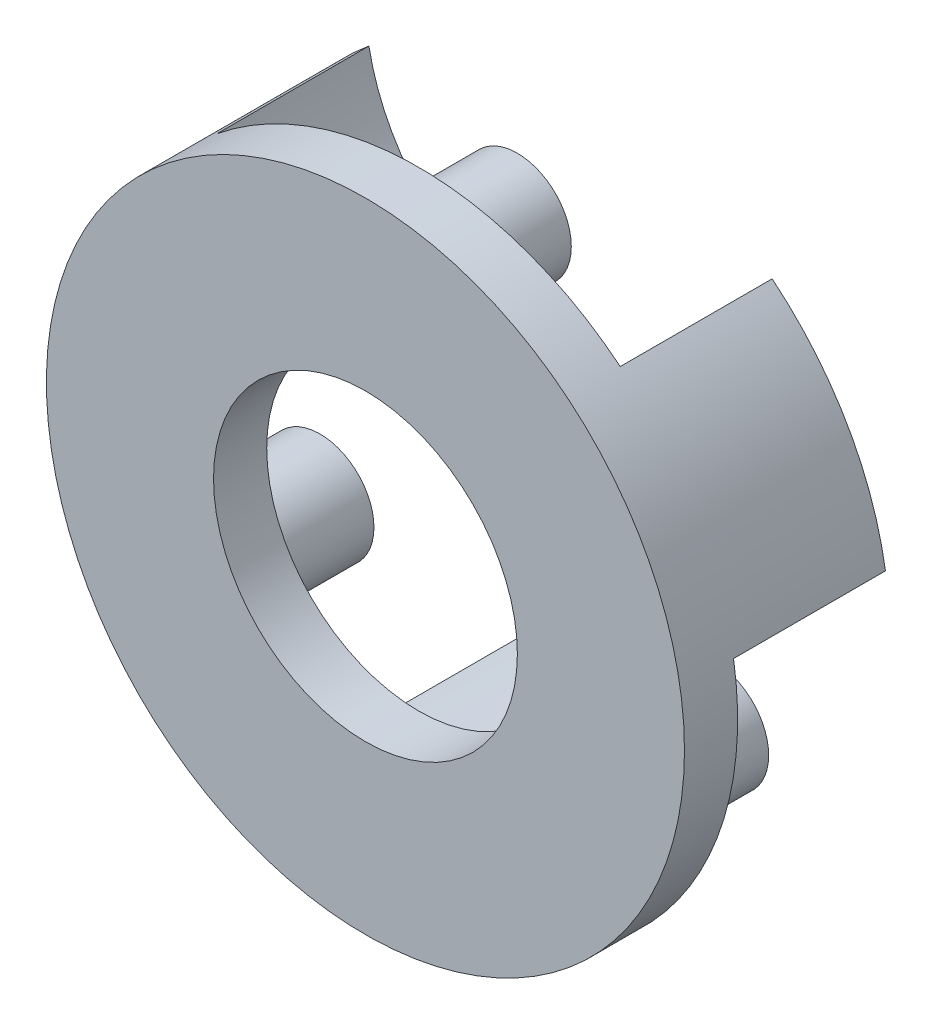
ISO-10303-21;
HEADER;
FILE_DESCRIPTION(('STEP AP214'),'2;1');
FILE_NAME('part.step','',(''),(''),'','','');
FILE_SCHEMA(('AUTOMOTIVE_DESIGN { 1 0 10303 214 1 1 1 1 }'));
ENDSEC;
DATA;
#1=APPLICATION_CONTEXT('core data for automotive mechanical design processes');
#2=APPLICATION_PROTOCOL_DEFINITION('international standard','automotive_design',2000,#1);
#3=PRODUCT_CONTEXT('',#1,'mechanical');
#4=PRODUCT('Part','Part','',(#3));
#5=PRODUCT_RELATED_PRODUCT_CATEGORY('part','',(#4));
#6=PRODUCT_DEFINITION_FORMATION('','',#4);
#7=PRODUCT_DEFINITION_CONTEXT('part definition',#1,'design');
#8=PRODUCT_DEFINITION('design','',#6,#7);
#9=PRODUCT_DEFINITION_SHAPE('','',#8);
#10=(LENGTH_UNIT() NAMED_UNIT(*) SI_UNIT(.MILLI.,.METRE.));
#11=(NAMED_UNIT(*) PLANE_ANGLE_UNIT() SI_UNIT($,.RADIAN.));
#12=(NAMED_UNIT(*) SI_UNIT($,.STERADIAN.) SOLID_ANGLE_UNIT());
#13=UNCERTAINTY_MEASURE_WITH_UNIT(LENGTH_MEASURE(1.E-05),#10,'distance_accuracy_value','');
#14=(GEOMETRIC_REPRESENTATION_CONTEXT(3) GLOBAL_UNCERTAINTY_ASSIGNED_CONTEXT((#13)) GLOBAL_UNIT_ASSIGNED_CONTEXT((#10,
#11,#12)) REPRESENTATION_CONTEXT('',''));
#15=CARTESIAN_POINT('',(0.,0.,0.));
#16=DIRECTION('',(0.,0.,1.));
#17=DIRECTION('',(1.,0.,0.));
#18=AXIS2_PLACEMENT_3D('',#15,#16,#17);
#19=CARTESIAN_POINT('',(0.,0.,0.));
#20=DIRECTION('',(0.,0.,1.));
#21=DIRECTION('',(1.,0.,0.));
#22=AXIS2_PLACEMENT_3D('',#19,#20,#21);
#23=PLANE('',#22);
#24=CARTESIAN_POINT('',(-12.9903810567656,-7.50000000000055,0.));
#25=DIRECTION('',(0.,0.,1.));
#26=DIRECTION('',(1.,0.,0.));
#27=AXIS2_PLACEMENT_3D('',#24,#25,#26);
#28=CIRCLE('',#27,3.55);
#29=CARTESIAN_POINT('',(-9.44038105676563,-7.50000000000055,0.));
#30=VERTEX_POINT('',#29);
#31=EDGE_CURVE('E611',#30,#30,#28,.T.);
#32=ORIENTED_EDGE('',*,*,#31,.T.);
#33=EDGE_LOOP('',(#32));
#34=FACE_BOUND('',#33,.T.);
#35=CARTESIAN_POINT('',(12.9903810567675,-7.49999999999945,0.));
#36=DIRECTION('',(0.,0.,1.));
#37=DIRECTION('',(1.,0.,0.));
#38=AXIS2_PLACEMENT_3D('',#35,#36,#37);
#39=CIRCLE('',#38,3.55);
#40=CARTESIAN_POINT('',(16.5403810567675,-7.49999999999945,0.));
#41=VERTEX_POINT('',#40);
#42=EDGE_CURVE('E618',#41,#41,#39,.T.);
#43=ORIENTED_EDGE('',*,*,#42,.T.);
#44=EDGE_LOOP('',(#43));
#45=FACE_BOUND('',#44,.T.);
#46=CARTESIAN_POINT('',(0.,15.,0.));
#47=DIRECTION('',(0.,0.,1.));
#48=DIRECTION('',(1.,0.,0.));
#49=AXIS2_PLACEMENT_3D('',#46,#47,#48);
#50=CIRCLE('',#49,3.55);
#51=CARTESIAN_POINT('',(3.55,15.,0.));
#52=VERTEX_POINT('',#51);
#53=EDGE_CURVE('E624',#52,#52,#50,.T.);
#54=ORIENTED_EDGE('',*,*,#53,.T.);
#55=EDGE_LOOP('',(#54));
#56=FACE_BOUND('',#55,.T.);
#57=CARTESIAN_POINT('',(0.,0.,0.));
#58=DIRECTION('',(0.,0.,-1.));
#59=DIRECTION('',(-1.,0.,0.));
#60=AXIS2_PLACEMENT_3D('',#57,#58,#59);
#61=CIRCLE('',#60,10.);
#62=CARTESIAN_POINT('',(-10.,0.,0.));
#63=VERTEX_POINT('',#62);
#64=EDGE_CURVE('E223',#63,#63,#61,.T.);
#65=ORIENTED_EDGE('',*,*,#64,.F.);
#66=EDGE_LOOP('',(#65));
#67=FACE_BOUND('',#66,.T.);
#68=CARTESIAN_POINT('',(0.,0.,0.));
#69=DIRECTION('',(0.,0.,-1.));
#70=DIRECTION('',(-1.,0.,0.));
#71=AXIS2_PLACEMENT_3D('',#68,#69,#70);
#72=CIRCLE('',#71,12.5);
#73=CARTESIAN_POINT('',(3.02191559121072,-12.1292219931699,0.));
#74=VERTEX_POINT('',#73);
#75=CARTESIAN_POINT('',(-3.02191559121221,-12.1292219931696,0.));
#76=VERTEX_POINT('',#75);
#77=EDGE_CURVE('E160',#74,#76,#72,.T.);
#78=ORIENTED_EDGE('',*,*,#77,.T.);
#79=CARTESIAN_POINT('',(-16.2379763209581,-9.37499999999878,0.));
#80=DIRECTION('',(0.,0.,-1.));
#81=DIRECTION('',(-1.,0.,0.));
#82=AXIS2_PLACEMENT_3D('',#79,#80,#81);
#83=CIRCLE('',#82,13.4999999999999);
#84=CARTESIAN_POINT('',(-7.45897050021628,-19.6306841214692,0.));
#85=VERTEX_POINT('',#84);
#86=EDGE_CURVE('E133',#76,#85,#83,.T.);
#87=ORIENTED_EDGE('',*,*,#86,.T.);
#88=CARTESIAN_POINT('',(0.,0.,0.));
#89=DIRECTION('',(0.,0.,1.));
#90=DIRECTION('',(1.,0.,0.));
#91=AXIS2_PLACEMENT_3D('',#88,#89,#90);
#92=CIRCLE('',#91,21.);
#93=CARTESIAN_POINT('',(-20.7301563929679,3.35568412147083,0.));
#94=VERTEX_POINT('',#93);
#95=EDGE_CURVE('E231',#94,#85,#92,.T.);
#96=ORIENTED_EDGE('',*,*,#95,.F.);
#97=CARTESIAN_POINT('',(-16.2379763209581,-9.37499999999878,0.));
#98=DIRECTION('',(0.,0.,-1.));
#99=DIRECTION('',(-1.,0.,0.));
#100=AXIS2_PLACEMENT_3D('',#97,#98,#99);
#101=CIRCLE('',#100,13.5);
#102=CARTESIAN_POINT('',(-12.0151721698315,3.44755532650412,0.));
#103=VERTEX_POINT('',#102);
#104=EDGE_CURVE('E62',#94,#103,#101,.T.);
#105=ORIENTED_EDGE('',*,*,#104,.T.);
#106=CARTESIAN_POINT('',(0.,0.,0.));
#107=DIRECTION('',(0.,0.,-1.));
#108=DIRECTION('',(-1.,0.,0.));
#109=AXIS2_PLACEMENT_3D('',#106,#107,#108);
#110=CIRCLE('',#109,12.5);
#111=CARTESIAN_POINT('',(-8.99325657861968,8.68166666666682,0.));
#112=VERTEX_POINT('',#111);
#113=EDGE_CURVE('E182',#103,#112,#110,.T.);
#114=ORIENTED_EDGE('',*,*,#113,.T.);
#115=CARTESIAN_POINT('',(1.09807996029332E-12,18.7499999999993,0.));
#116=DIRECTION('',(0.,0.,-1.));
#117=DIRECTION('',(-1.,0.,0.));
#118=AXIS2_PLACEMENT_3D('',#115,#116,#117);
#119=CIRCLE('',#118,13.5);
#120=CARTESIAN_POINT('',(-13.2711858927519,16.2750000000007,0.));
#121=VERTEX_POINT('',#120);
#122=EDGE_CURVE('E138',#112,#121,#119,.T.);
#123=ORIENTED_EDGE('',*,*,#122,.T.);
#124=CARTESIAN_POINT('',(13.2711858927538,16.2749999999991,0.));
#125=VERTEX_POINT('',#124);
#126=EDGE_CURVE('E43',#125,#121,#92,.T.);
#127=ORIENTED_EDGE('',*,*,#126,.F.);
#128=CARTESIAN_POINT('',(1.09807996029332E-12,18.7499999999993,0.));
#129=DIRECTION('',(0.,0.,-1.));
#130=DIRECTION('',(-1.,0.,0.));
#131=AXIS2_PLACEMENT_3D('',#128,#129,#130);
#132=CIRCLE('',#131,13.5);
#133=CARTESIAN_POINT('',(8.9932565786207,8.68166666666577,0.));
#134=VERTEX_POINT('',#133);
#135=EDGE_CURVE('E198',#125,#134,#132,.T.);
#136=ORIENTED_EDGE('',*,*,#135,.T.);
#137=CARTESIAN_POINT('',(0.,0.,0.));
#138=DIRECTION('',(0.,0.,-1.));
#139=DIRECTION('',(-1.,0.,0.));
#140=AXIS2_PLACEMENT_3D('',#137,#138,#139);
#141=CIRCLE('',#140,12.5);
#142=CARTESIAN_POINT('',(12.0151721698319,3.4475553265027,0.));
#143=VERTEX_POINT('',#142);
#144=EDGE_CURVE('E209',#134,#143,#141,.T.);
#145=ORIENTED_EDGE('',*,*,#144,.T.);
#146=CARTESIAN_POINT('',(16.237976320957,-9.37500000000068,0.));
#147=DIRECTION('',(0.,0.,-1.));
#148=DIRECTION('',(-1.,0.,0.));
#149=AXIS2_PLACEMENT_3D('',#146,#147,#148);
#150=CIRCLE('',#149,13.5);
#151=CARTESIAN_POINT('',(20.7301563929683,3.35568412146838,0.));
#152=VERTEX_POINT('',#151);
#153=EDGE_CURVE('E193',#143,#152,#150,.T.);
#154=ORIENTED_EDGE('',*,*,#153,.T.);
#155=CARTESIAN_POINT('',(7.45897050021399,-19.6306841214701,0.));
#156=VERTEX_POINT('',#155);
#157=EDGE_CURVE('E228',#156,#152,#92,.T.);
#158=ORIENTED_EDGE('',*,*,#157,.F.);
#159=CARTESIAN_POINT('',(16.237976320957,-9.37500000000068,0.));
#160=DIRECTION('',(0.,0.,-1.));
#161=DIRECTION('',(-1.,0.,0.));
#162=AXIS2_PLACEMENT_3D('',#159,#160,#161);
#163=CIRCLE('',#162,13.5);
#164=EDGE_CURVE('E54',#156,#74,#163,.T.);
#165=ORIENTED_EDGE('',*,*,#164,.T.);
#166=EDGE_LOOP('',(#78,#87,#96,#105,#114,#123,#127,#136,#145,#154,#158,#165));
#167=FACE_BOUND('',#166,.T.);
#168=ADVANCED_FACE('F39',(#34,#45,#56,#67,#167),#23,.F.);
#169=CARTESIAN_POINT('',(0.,0.,3.5));
#170=DIRECTION('',(0.,0.,-1.));
#171=DIRECTION('',(-1.,0.,0.));
#172=AXIS2_PLACEMENT_3D('',#169,#170,#171);
#173=CYLINDRICAL_SURFACE('',#172,21.);
#174=CARTESIAN_POINT('',(0.,0.,3.5));
#175=DIRECTION('',(0.,0.,1.));
#176=DIRECTION('',(1.,0.,0.));
#177=AXIS2_PLACEMENT_3D('',#174,#175,#176);
#178=CIRCLE('',#177,21.);
#179=CARTESIAN_POINT('',(21.,0.,3.5));
#180=VERTEX_POINT('',#179);
#181=EDGE_CURVE('E11',#180,#180,#178,.T.);
#182=ORIENTED_EDGE('',*,*,#181,.F.);
#183=EDGE_LOOP('',(#182));
#184=FACE_BOUND('',#183,.T.);
#185=ORIENTED_EDGE('',*,*,#126,.T.);
#186=DIRECTION('',(0.,0.,1.));
#187=VECTOR('',#186,1.);
#188=CARTESIAN_POINT('',(-13.2711858927519,16.2750000000007,-10.));
#189=LINE('',#188,#187);
#190=CARTESIAN_POINT('',(-13.2711858927519,16.2750000000007,-10.));
#191=VERTEX_POINT('',#190);
#192=EDGE_CURVE('E179',#191,#121,#189,.T.);
#193=ORIENTED_EDGE('',*,*,#192,.F.);
#194=CARTESIAN_POINT('',(0.,0.,-10.));
#195=DIRECTION('',(0.,0.,-1.));
#196=DIRECTION('',(-1.,0.,0.));
#197=AXIS2_PLACEMENT_3D('',#194,#195,#196);
#198=CIRCLE('',#197,21.);
#199=CARTESIAN_POINT('',(-20.7301563929679,3.35568412147083,-10.));
#200=VERTEX_POINT('',#199);
#201=EDGE_CURVE('E177',#200,#191,#198,.T.);
#202=ORIENTED_EDGE('',*,*,#201,.F.);
#203=DIRECTION('',(0.,0.,1.));
#204=VECTOR('',#203,1.);
#205=CARTESIAN_POINT('',(-20.7301563929679,3.35568412147083,-10.));
#206=LINE('',#205,#204);
#207=EDGE_CURVE('E187',#200,#94,#206,.T.);
#208=ORIENTED_EDGE('',*,*,#207,.T.);
#209=ORIENTED_EDGE('',*,*,#95,.T.);
#210=DIRECTION('',(0.,0.,1.));
#211=VECTOR('',#210,1.);
#212=CARTESIAN_POINT('',(-7.45897050021628,-19.6306841214692,-10.));
#213=LINE('',#212,#211);
#214=CARTESIAN_POINT('',(-7.45897050021628,-19.6306841214692,-10.));
#215=VERTEX_POINT('',#214);
#216=EDGE_CURVE('E158',#215,#85,#213,.T.);
#217=ORIENTED_EDGE('',*,*,#216,.F.);
#218=CARTESIAN_POINT('',(0.,0.,-10.));
#219=DIRECTION('',(0.,0.,-1.));
#220=DIRECTION('',(-1.,0.,0.));
#221=AXIS2_PLACEMENT_3D('',#218,#219,#220);
#222=CIRCLE('',#221,21.);
#223=CARTESIAN_POINT('',(7.45897050021399,-19.6306841214701,-10.));
#224=VERTEX_POINT('',#223);
#225=EDGE_CURVE('E148',#224,#215,#222,.T.);
#226=ORIENTED_EDGE('',*,*,#225,.F.);
#227=DIRECTION('',(0.,0.,1.));
#228=VECTOR('',#227,1.);
#229=CARTESIAN_POINT('',(7.45897050021399,-19.6306841214701,-10.));
#230=LINE('',#229,#228);
#231=EDGE_CURVE('E165',#224,#156,#230,.T.);
#232=ORIENTED_EDGE('',*,*,#231,.T.);
#233=ORIENTED_EDGE('',*,*,#157,.T.);
#234=DIRECTION('',(0.,0.,1.));
#235=VECTOR('',#234,1.);
#236=CARTESIAN_POINT('',(20.7301563929683,3.35568412146838,-10.));
#237=LINE('',#236,#235);
#238=CARTESIAN_POINT('',(20.7301563929683,3.35568412146838,-10.));
#239=VERTEX_POINT('',#238);
#240=EDGE_CURVE('E206',#239,#152,#237,.T.);
#241=ORIENTED_EDGE('',*,*,#240,.F.);
#242=CARTESIAN_POINT('',(0.,0.,-10.));
#243=DIRECTION('',(0.,0.,-1.));
#244=DIRECTION('',(-1.,0.,0.));
#245=AXIS2_PLACEMENT_3D('',#242,#243,#244);
#246=CIRCLE('',#245,21.);
#247=CARTESIAN_POINT('',(13.2711858927538,16.2749999999991,-10.));
#248=VERTEX_POINT('',#247);
#249=EDGE_CURVE('E204',#248,#239,#246,.T.);
#250=ORIENTED_EDGE('',*,*,#249,.F.);
#251=DIRECTION('',(0.,0.,1.));
#252=VECTOR('',#251,1.);
#253=CARTESIAN_POINT('',(13.2711858927538,16.2749999999991,-10.));
#254=LINE('',#253,#252);
#255=EDGE_CURVE('E216',#248,#125,#254,.T.);
#256=ORIENTED_EDGE('',*,*,#255,.T.);
#257=EDGE_LOOP('',(#185,#193,#202,#208,#209,#217,#226,#232,#233,#241,#250,#256));
#258=FACE_BOUND('',#257,.T.);
#259=ADVANCED_FACE('F41',(#184,#258),#173,.T.);
#260=CARTESIAN_POINT('',(0.,0.,3.5));
#261=DIRECTION('',(0.,0.,1.));
#262=DIRECTION('',(1.,0.,0.));
#263=AXIS2_PLACEMENT_3D('',#260,#261,#262);
#264=PLANE('',#263);
#265=CARTESIAN_POINT('',(0.,0.,3.5));
#266=DIRECTION('',(0.,0.,1.));
#267=DIRECTION('',(1.,0.,0.));
#268=AXIS2_PLACEMENT_3D('',#265,#266,#267);
#269=CIRCLE('',#268,10.);
#270=CARTESIAN_POINT('',(10.,0.,3.5));
#271=VERTEX_POINT('',#270);
#272=EDGE_CURVE('E226',#271,#271,#269,.T.);
#273=ORIENTED_EDGE('',*,*,#272,.F.);
#274=EDGE_LOOP('',(#273));
#275=FACE_BOUND('',#274,.T.);
#276=ORIENTED_EDGE('',*,*,#181,.T.);
#277=EDGE_LOOP('',(#276));
#278=FACE_BOUND('',#277,.T.);
#279=ADVANCED_FACE('F284',(#275,#278),#264,.T.);
#280=CARTESIAN_POINT('',(0.,0.,8.2));
#281=DIRECTION('',(0.,0.,-1.));
#282=DIRECTION('',(-1.,0.,0.));
#283=AXIS2_PLACEMENT_3D('',#280,#281,#282);
#284=CYLINDRICAL_SURFACE('',#283,10.);
#285=ORIENTED_EDGE('',*,*,#272,.T.);
#286=EDGE_LOOP('',(#285));
#287=FACE_BOUND('',#286,.T.);
#288=ORIENTED_EDGE('',*,*,#64,.T.);
#289=EDGE_LOOP('',(#288));
#290=FACE_BOUND('',#289,.T.);
#291=ADVANCED_FACE('F291',(#287,#290),#284,.F.);
#292=CARTESIAN_POINT('',(16.237976320957,-9.37500000000068,-10.));
#293=DIRECTION('',(0.,0.,1.));
#294=DIRECTION('',(1.,0.,0.));
#295=AXIS2_PLACEMENT_3D('',#292,#293,#294);
#296=CYLINDRICAL_SURFACE('',#295,13.5);
#297=ORIENTED_EDGE('',*,*,#153,.F.);
#298=DIRECTION('',(0.,0.,1.));
#299=VECTOR('',#298,1.);
#300=CARTESIAN_POINT('',(12.0151721698319,3.4475553265027,-10.));
#301=LINE('',#300,#299);
#302=CARTESIAN_POINT('',(12.0151721698319,3.4475553265027,-10.));
#303=VERTEX_POINT('',#302);
#304=EDGE_CURVE('E220',#303,#143,#301,.T.);
#305=ORIENTED_EDGE('',*,*,#304,.F.);
#306=CARTESIAN_POINT('',(16.237976320957,-9.37500000000068,-10.));
#307=DIRECTION('',(0.,0.,-1.));
#308=DIRECTION('',(-1.,0.,0.));
#309=AXIS2_PLACEMENT_3D('',#306,#307,#308);
#310=CIRCLE('',#309,13.5);
#311=EDGE_CURVE('E194',#303,#239,#310,.T.);
#312=ORIENTED_EDGE('',*,*,#311,.T.);
#313=ORIENTED_EDGE('',*,*,#240,.T.);
#314=EDGE_LOOP('',(#297,#305,#312,#313));
#315=FACE_BOUND('',#314,.T.);
#316=ADVANCED_FACE('F258',(#315),#296,.F.);
#317=CARTESIAN_POINT('',(0.,0.,-10.));
#318=DIRECTION('',(0.,0.,1.));
#319=DIRECTION('',(1.,0.,0.));
#320=AXIS2_PLACEMENT_3D('',#317,#318,#319);
#321=CYLINDRICAL_SURFACE('',#320,12.5);
#322=ORIENTED_EDGE('',*,*,#144,.F.);
#323=DIRECTION('',(0.,0.,1.));
#324=VECTOR('',#323,1.);
#325=CARTESIAN_POINT('',(8.9932565786207,8.68166666666577,-10.));
#326=LINE('',#325,#324);
#327=CARTESIAN_POINT('',(8.9932565786207,8.68166666666577,-10.));
#328=VERTEX_POINT('',#327);
#329=EDGE_CURVE('E218',#328,#134,#326,.T.);
#330=ORIENTED_EDGE('',*,*,#329,.F.);
#331=CARTESIAN_POINT('',(0.,0.,-10.));
#332=DIRECTION('',(0.,0.,-1.));
#333=DIRECTION('',(-1.,0.,0.));
#334=AXIS2_PLACEMENT_3D('',#331,#332,#333);
#335=CIRCLE('',#334,12.5);
#336=EDGE_CURVE('E197',#328,#303,#335,.T.);
#337=ORIENTED_EDGE('',*,*,#336,.T.);
#338=ORIENTED_EDGE('',*,*,#304,.T.);
#339=EDGE_LOOP('',(#322,#330,#337,#338));
#340=FACE_BOUND('',#339,.T.);
#341=ADVANCED_FACE('F261',(#340),#321,.F.);
#342=CARTESIAN_POINT('',(1.09807996029332E-12,18.7499999999993,-10.));
#343=DIRECTION('',(0.,0.,1.));
#344=DIRECTION('',(1.,0.,0.));
#345=AXIS2_PLACEMENT_3D('',#342,#343,#344);
#346=CYLINDRICAL_SURFACE('',#345,13.5);
#347=ORIENTED_EDGE('',*,*,#135,.F.);
#348=ORIENTED_EDGE('',*,*,#255,.F.);
#349=CARTESIAN_POINT('',(1.09807996029332E-12,18.7499999999993,-10.));
#350=DIRECTION('',(0.,0.,-1.));
#351=DIRECTION('',(-1.,0.,0.));
#352=AXIS2_PLACEMENT_3D('',#349,#350,#351);
#353=CIRCLE('',#352,13.5);
#354=EDGE_CURVE('E201',#248,#328,#353,.T.);
#355=ORIENTED_EDGE('',*,*,#354,.T.);
#356=ORIENTED_EDGE('',*,*,#329,.T.);
#357=EDGE_LOOP('',(#347,#348,#355,#356));
#358=FACE_BOUND('',#357,.T.);
#359=ADVANCED_FACE('F267',(#358),#346,.F.);
#360=CARTESIAN_POINT('',(0.,0.,-10.));
#361=DIRECTION('',(0.,0.,-1.));
#362=DIRECTION('',(-1.,0.,0.));
#363=AXIS2_PLACEMENT_3D('',#360,#361,#362);
#364=PLANE('',#363);
#365=CARTESIAN_POINT('',(13.8564064605515,7.99999999999844,-10.));
#366=DIRECTION('',(0.,0.,-1.));
#367=DIRECTION('',(-1.,0.,0.));
#368=AXIS2_PLACEMENT_3D('',#365,#366,#367);
#369=CIRCLE('',#368,1.50000000000057);
#370=CARTESIAN_POINT('',(12.3564064605509,7.99999999999844,-10.));
#371=VERTEX_POINT('',#370);
#372=EDGE_CURVE('E639',#371,#371,#369,.T.);
#373=ORIENTED_EDGE('',*,*,#372,.F.);
#374=EDGE_LOOP('',(#373));
#375=FACE_BOUND('',#374,.T.);
#376=ORIENTED_EDGE('',*,*,#311,.F.);
#377=ORIENTED_EDGE('',*,*,#336,.F.);
#378=ORIENTED_EDGE('',*,*,#354,.F.);
#379=ORIENTED_EDGE('',*,*,#249,.T.);
#380=EDGE_LOOP('',(#376,#377,#378,#379));
#381=FACE_BOUND('',#380,.T.);
#382=ADVANCED_FACE('F265',(#375,#381),#364,.T.);
#383=CARTESIAN_POINT('',(1.09807996029332E-12,18.7499999999993,-10.));
#384=DIRECTION('',(0.,0.,1.));
#385=DIRECTION('',(1.,0.,0.));
#386=AXIS2_PLACEMENT_3D('',#383,#384,#385);
#387=CYLINDRICAL_SURFACE('',#386,13.5);
#388=ORIENTED_EDGE('',*,*,#122,.F.);
#389=DIRECTION('',(0.,0.,1.));
#390=VECTOR('',#389,1.);
#391=CARTESIAN_POINT('',(-8.99325657861968,8.68166666666682,-10.));
#392=LINE('',#391,#390);
#393=CARTESIAN_POINT('',(-8.99325657861968,8.68166666666682,-10.));
#394=VERTEX_POINT('',#393);
#395=EDGE_CURVE('E191',#394,#112,#392,.T.);
#396=ORIENTED_EDGE('',*,*,#395,.F.);
#397=CARTESIAN_POINT('',(1.09807996029332E-12,18.7499999999993,-10.));
#398=DIRECTION('',(0.,0.,-1.));
#399=DIRECTION('',(-1.,0.,0.));
#400=AXIS2_PLACEMENT_3D('',#397,#398,#399);
#401=CIRCLE('',#400,13.5);
#402=EDGE_CURVE('E168',#394,#191,#401,.T.);
#403=ORIENTED_EDGE('',*,*,#402,.T.);
#404=ORIENTED_EDGE('',*,*,#192,.T.);
#405=EDGE_LOOP('',(#388,#396,#403,#404));
#406=FACE_BOUND('',#405,.T.);
#407=ADVANCED_FACE('F246',(#406),#387,.F.);
#408=CARTESIAN_POINT('',(0.,0.,-10.));
#409=DIRECTION('',(0.,0.,1.));
#410=DIRECTION('',(1.,0.,0.));
#411=AXIS2_PLACEMENT_3D('',#408,#409,#410);
#412=CYLINDRICAL_SURFACE('',#411,12.5);
#413=ORIENTED_EDGE('',*,*,#113,.F.);
#414=DIRECTION('',(0.,0.,1.));
#415=VECTOR('',#414,1.);
#416=CARTESIAN_POINT('',(-12.0151721698315,3.44755532650412,-10.));
#417=LINE('',#416,#415);
#418=CARTESIAN_POINT('',(-12.0151721698315,3.44755532650412,-10.));
#419=VERTEX_POINT('',#418);
#420=EDGE_CURVE('E189',#419,#103,#417,.T.);
#421=ORIENTED_EDGE('',*,*,#420,.F.);
#422=CARTESIAN_POINT('',(0.,0.,-10.));
#423=DIRECTION('',(0.,0.,-1.));
#424=DIRECTION('',(-1.,0.,0.));
#425=AXIS2_PLACEMENT_3D('',#422,#423,#424);
#426=CIRCLE('',#425,12.5);
#427=EDGE_CURVE('E171',#419,#394,#426,.T.);
#428=ORIENTED_EDGE('',*,*,#427,.T.);
#429=ORIENTED_EDGE('',*,*,#395,.T.);
#430=EDGE_LOOP('',(#413,#421,#428,#429));
#431=FACE_BOUND('',#430,.T.);
#432=ADVANCED_FACE('F253',(#431),#412,.F.);
#433=CARTESIAN_POINT('',(-16.2379763209581,-9.37499999999878,-10.));
#434=DIRECTION('',(0.,0.,1.));
#435=DIRECTION('',(1.,0.,0.));
#436=AXIS2_PLACEMENT_3D('',#433,#434,#435);
#437=CYLINDRICAL_SURFACE('',#436,13.5);
#438=ORIENTED_EDGE('',*,*,#104,.F.);
#439=ORIENTED_EDGE('',*,*,#207,.F.);
#440=CARTESIAN_POINT('',(-16.2379763209581,-9.37499999999878,-10.));
#441=DIRECTION('',(0.,0.,-1.));
#442=DIRECTION('',(-1.,0.,0.));
#443=AXIS2_PLACEMENT_3D('',#440,#441,#442);
#444=CIRCLE('',#443,13.5);
#445=EDGE_CURVE('E174',#200,#419,#444,.T.);
#446=ORIENTED_EDGE('',*,*,#445,.T.);
#447=ORIENTED_EDGE('',*,*,#420,.T.);
#448=EDGE_LOOP('',(#438,#439,#446,#447));
#449=FACE_BOUND('',#448,.T.);
#450=ADVANCED_FACE('F254',(#449),#437,.F.);
#451=CARTESIAN_POINT('',(0.,0.,-10.));
#452=DIRECTION('',(0.,0.,-1.));
#453=DIRECTION('',(-1.,0.,0.));
#454=AXIS2_PLACEMENT_3D('',#451,#452,#453);
#455=PLANE('',#454);
#456=CARTESIAN_POINT('',(-13.8564064605506,8.00000000000078,-10.));
#457=DIRECTION('',(0.,0.,-1.));
#458=DIRECTION('',(-1.,0.,0.));
#459=AXIS2_PLACEMENT_3D('',#456,#457,#458);
#460=CIRCLE('',#459,1.5);
#461=CARTESIAN_POINT('',(-15.3564064605506,8.00000000000078,-10.));
#462=VERTEX_POINT('',#461);
#463=EDGE_CURVE('E630',#462,#462,#460,.T.);
#464=ORIENTED_EDGE('',*,*,#463,.F.);
#465=EDGE_LOOP('',(#464));
#466=FACE_BOUND('',#465,.T.);
#467=ORIENTED_EDGE('',*,*,#402,.F.);
#468=ORIENTED_EDGE('',*,*,#427,.F.);
#469=ORIENTED_EDGE('',*,*,#445,.F.);
#470=ORIENTED_EDGE('',*,*,#201,.T.);
#471=EDGE_LOOP('',(#467,#468,#469,#470));
#472=FACE_BOUND('',#471,.T.);
#473=ADVANCED_FACE('F250',(#466,#472),#455,.T.);
#474=CARTESIAN_POINT('',(-16.2379763209581,-9.37499999999878,-10.));
#475=DIRECTION('',(0.,0.,1.));
#476=DIRECTION('',(1.,0.,0.));
#477=AXIS2_PLACEMENT_3D('',#474,#475,#476);
#478=CYLINDRICAL_SURFACE('',#477,13.4999999999999);
#479=ORIENTED_EDGE('',*,*,#86,.F.);
#480=DIRECTION('',(0.,0.,1.));
#481=VECTOR('',#480,1.);
#482=CARTESIAN_POINT('',(-3.02191559121221,-12.1292219931696,-10.));
#483=LINE('',#482,#481);
#484=CARTESIAN_POINT('',(-3.02191559121221,-12.1292219931696,-10.));
#485=VERTEX_POINT('',#484);
#486=EDGE_CURVE('E128',#485,#76,#483,.T.);
#487=ORIENTED_EDGE('',*,*,#486,.F.);
#488=CARTESIAN_POINT('',(-16.2379763209581,-9.37499999999878,-10.));
#489=DIRECTION('',(0.,0.,-1.));
#490=DIRECTION('',(-1.,0.,0.));
#491=AXIS2_PLACEMENT_3D('',#488,#489,#490);
#492=CIRCLE('',#491,13.4999999999999);
#493=EDGE_CURVE('E131',#485,#215,#492,.T.);
#494=ORIENTED_EDGE('',*,*,#493,.T.);
#495=ORIENTED_EDGE('',*,*,#216,.T.);
#496=EDGE_LOOP('',(#479,#487,#494,#495));
#497=FACE_BOUND('',#496,.T.);
#498=ADVANCED_FACE('F130',(#497),#478,.F.);
#499=CARTESIAN_POINT('',(0.,0.,-10.));
#500=DIRECTION('',(0.,0.,1.));
#501=DIRECTION('',(1.,0.,0.));
#502=AXIS2_PLACEMENT_3D('',#499,#500,#501);
#503=CYLINDRICAL_SURFACE('',#502,12.5);
#504=ORIENTED_EDGE('',*,*,#77,.F.);
#505=DIRECTION('',(0.,0.,1.));
#506=VECTOR('',#505,1.);
#507=CARTESIAN_POINT('',(3.02191559121072,-12.1292219931699,-10.));
#508=LINE('',#507,#506);
#509=CARTESIAN_POINT('',(3.02191559121072,-12.1292219931699,-10.));
#510=VERTEX_POINT('',#509);
#511=EDGE_CURVE('E139',#510,#74,#508,.T.);
#512=ORIENTED_EDGE('',*,*,#511,.F.);
#513=CARTESIAN_POINT('',(0.,0.,-10.));
#514=DIRECTION('',(0.,0.,-1.));
#515=DIRECTION('',(-1.,0.,0.));
#516=AXIS2_PLACEMENT_3D('',#513,#514,#515);
#517=CIRCLE('',#516,12.5);
#518=EDGE_CURVE('E145',#510,#485,#517,.T.);
#519=ORIENTED_EDGE('',*,*,#518,.T.);
#520=ORIENTED_EDGE('',*,*,#486,.T.);
#521=EDGE_LOOP('',(#504,#512,#519,#520));
#522=FACE_BOUND('',#521,.T.);
#523=ADVANCED_FACE('F151',(#522),#503,.F.);
#524=CARTESIAN_POINT('',(16.237976320957,-9.37500000000068,-10.));
#525=DIRECTION('',(0.,0.,1.));
#526=DIRECTION('',(1.,0.,0.));
#527=AXIS2_PLACEMENT_3D('',#524,#525,#526);
#528=CYLINDRICAL_SURFACE('',#527,13.5);
#529=ORIENTED_EDGE('',*,*,#164,.F.);
#530=ORIENTED_EDGE('',*,*,#231,.F.);
#531=CARTESIAN_POINT('',(16.237976320957,-9.37500000000068,-10.));
#532=DIRECTION('',(0.,0.,-1.));
#533=DIRECTION('',(-1.,0.,0.));
#534=AXIS2_PLACEMENT_3D('',#531,#532,#533);
#535=CIRCLE('',#534,13.5);
#536=EDGE_CURVE('E152',#224,#510,#535,.T.);
#537=ORIENTED_EDGE('',*,*,#536,.T.);
#538=ORIENTED_EDGE('',*,*,#511,.T.);
#539=EDGE_LOOP('',(#529,#530,#537,#538));
#540=FACE_BOUND('',#539,.T.);
#541=ADVANCED_FACE('F359',(#540),#528,.F.);
#542=CARTESIAN_POINT('',(0.,0.,-10.));
#543=DIRECTION('',(0.,0.,-1.));
#544=DIRECTION('',(-1.,0.,0.));
#545=AXIS2_PLACEMENT_3D('',#542,#543,#544);
#546=PLANE('',#545);
#547=CARTESIAN_POINT('',(-1.58372237557348E-12,-16.0000000000004,-10.));
#548=DIRECTION('',(0.,0.,-1.));
#549=DIRECTION('',(-1.,0.,0.));
#550=AXIS2_PLACEMENT_3D('',#547,#548,#549);
#551=CIRCLE('',#550,1.4999999999998);
#552=CARTESIAN_POINT('',(-1.50000000000138,-16.0000000000004,-10.));
#553=VERTEX_POINT('',#552);
#554=EDGE_CURVE('E633',#553,#553,#551,.T.);
#555=ORIENTED_EDGE('',*,*,#554,.F.);
#556=EDGE_LOOP('',(#555));
#557=FACE_BOUND('',#556,.T.);
#558=ORIENTED_EDGE('',*,*,#493,.F.);
#559=ORIENTED_EDGE('',*,*,#518,.F.);
#560=ORIENTED_EDGE('',*,*,#536,.F.);
#561=ORIENTED_EDGE('',*,*,#225,.T.);
#562=EDGE_LOOP('',(#558,#559,#560,#561));
#563=FACE_BOUND('',#562,.T.);
#564=ADVANCED_FACE('F143',(#557,#563),#546,.T.);
#565=CARTESIAN_POINT('',(-1.58372237557348E-12,-16.0000000000004,-5.));
#566=DIRECTION('',(0.,0.,-1.));
#567=DIRECTION('',(-1.,0.,0.));
#568=AXIS2_PLACEMENT_3D('',#565,#566,#567);
#569=CYLINDRICAL_SURFACE('',#568,1.4999999999998);
#570=CARTESIAN_POINT('',(-1.58372237557348E-12,-16.0000000000004,-5.));
#571=DIRECTION('',(0.,0.,-1.));
#572=DIRECTION('',(-1.,0.,0.));
#573=AXIS2_PLACEMENT_3D('',#570,#571,#572);
#574=CIRCLE('',#573,1.4999999999998);
#575=CARTESIAN_POINT('',(-1.50000000000138,-16.0000000000004,-5.));
#576=VERTEX_POINT('',#575);
#577=EDGE_CURVE('E636',#576,#576,#574,.T.);
#578=ORIENTED_EDGE('',*,*,#577,.F.);
#579=EDGE_LOOP('',(#578));
#580=FACE_BOUND('',#579,.T.);
#581=ORIENTED_EDGE('',*,*,#554,.T.);
#582=EDGE_LOOP('',(#581));
#583=FACE_BOUND('',#582,.T.);
#584=ADVANCED_FACE('F392',(#580,#583),#569,.F.);
#585=CARTESIAN_POINT('',(-1.58372237557348E-12,-16.0000000000004,-5.));
#586=DIRECTION('',(0.,0.,-1.));
#587=DIRECTION('',(-1.,0.,0.));
#588=AXIS2_PLACEMENT_3D('',#585,#586,#587);
#589=PLANE('',#588);
#590=ORIENTED_EDGE('',*,*,#577,.T.);
#591=EDGE_LOOP('',(#590));
#592=FACE_BOUND('',#591,.T.);
#593=ADVANCED_FACE('F403',(#592),#589,.T.);
#594=CARTESIAN_POINT('',(-13.8564064605506,8.00000000000078,-5.));
#595=DIRECTION('',(0.,0.,-1.));
#596=DIRECTION('',(-1.,0.,0.));
#597=AXIS2_PLACEMENT_3D('',#594,#595,#596);
#598=CYLINDRICAL_SURFACE('',#597,1.5);
#599=CARTESIAN_POINT('',(-13.8564064605506,8.00000000000078,-5.));
#600=DIRECTION('',(0.,0.,-1.));
#601=DIRECTION('',(-1.,0.,0.));
#602=AXIS2_PLACEMENT_3D('',#599,#600,#601);
#603=CIRCLE('',#602,1.5);
#604=CARTESIAN_POINT('',(-15.3564064605506,8.00000000000078,-5.));
#605=VERTEX_POINT('',#604);
#606=EDGE_CURVE('E161',#605,#605,#603,.T.);
#607=ORIENTED_EDGE('',*,*,#606,.F.);
#608=EDGE_LOOP('',(#607));
#609=FACE_BOUND('',#608,.T.);
#610=ORIENTED_EDGE('',*,*,#463,.T.);
#611=EDGE_LOOP('',(#610));
#612=FACE_BOUND('',#611,.T.);
#613=ADVANCED_FACE('F414',(#609,#612),#598,.F.);
#614=CARTESIAN_POINT('',(-13.8564064605506,8.00000000000078,-5.));
#615=DIRECTION('',(0.,0.,-1.));
#616=DIRECTION('',(-1.,0.,0.));
#617=AXIS2_PLACEMENT_3D('',#614,#615,#616);
#618=PLANE('',#617);
#619=ORIENTED_EDGE('',*,*,#606,.T.);
#620=EDGE_LOOP('',(#619));
#621=FACE_BOUND('',#620,.T.);
#622=ADVANCED_FACE('F425',(#621),#618,.T.);
#623=CARTESIAN_POINT('',(13.8564064605515,7.99999999999844,-5.));
#624=DIRECTION('',(0.,0.,-1.));
#625=DIRECTION('',(-1.,0.,0.));
#626=AXIS2_PLACEMENT_3D('',#623,#624,#625);
#627=CYLINDRICAL_SURFACE('',#626,1.50000000000057);
#628=CARTESIAN_POINT('',(13.8564064605515,7.99999999999844,-5.));
#629=DIRECTION('',(0.,0.,-1.));
#630=DIRECTION('',(-1.,0.,0.));
#631=AXIS2_PLACEMENT_3D('',#628,#629,#630);
#632=CIRCLE('',#631,1.50000000000057);
#633=CARTESIAN_POINT('',(12.3564064605509,7.99999999999844,-5.));
#634=VERTEX_POINT('',#633);
#635=EDGE_CURVE('E627',#634,#634,#632,.T.);
#636=ORIENTED_EDGE('',*,*,#635,.F.);
#637=EDGE_LOOP('',(#636));
#638=FACE_BOUND('',#637,.T.);
#639=ORIENTED_EDGE('',*,*,#372,.T.);
#640=EDGE_LOOP('',(#639));
#641=FACE_BOUND('',#640,.T.);
#642=ADVANCED_FACE('F436',(#638,#641),#627,.F.);
#643=CARTESIAN_POINT('',(13.8564064605515,7.99999999999844,-5.));
#644=DIRECTION('',(0.,0.,-1.));
#645=DIRECTION('',(-1.,0.,0.));
#646=AXIS2_PLACEMENT_3D('',#643,#644,#645);
#647=PLANE('',#646);
#648=ORIENTED_EDGE('',*,*,#635,.T.);
#649=EDGE_LOOP('',(#648));
#650=FACE_BOUND('',#649,.T.);
#651=ADVANCED_FACE('F446',(#650),#647,.T.);
#652=CARTESIAN_POINT('',(0.,15.,-6.5));
#653=DIRECTION('',(0.,0.,1.));
#654=DIRECTION('',(1.,0.,0.));
#655=AXIS2_PLACEMENT_3D('',#652,#653,#654);
#656=CYLINDRICAL_SURFACE('',#655,3.55);
#657=CARTESIAN_POINT('',(0.,15.,-6.5));
#658=DIRECTION('',(0.,0.,1.));
#659=DIRECTION('',(1.,0.,0.));
#660=AXIS2_PLACEMENT_3D('',#657,#658,#659);
#661=CIRCLE('',#660,3.55);
#662=CARTESIAN_POINT('',(3.55,15.,-6.5));
#663=VERTEX_POINT('',#662);
#664=EDGE_CURVE('E621',#663,#663,#661,.T.);
#665=ORIENTED_EDGE('',*,*,#664,.T.);
#666=EDGE_LOOP('',(#665));
#667=FACE_BOUND('',#666,.T.);
#668=ORIENTED_EDGE('',*,*,#53,.F.);
#669=EDGE_LOOP('',(#668));
#670=FACE_BOUND('',#669,.T.);
#671=ADVANCED_FACE('F456',(#667,#670),#656,.T.);
#672=CARTESIAN_POINT('',(0.,15.,-6.5));
#673=DIRECTION('',(0.,0.,1.));
#674=DIRECTION('',(1.,0.,0.));
#675=AXIS2_PLACEMENT_3D('',#672,#673,#674);
#676=PLANE('',#675);
#677=ORIENTED_EDGE('',*,*,#664,.F.);
#678=EDGE_LOOP('',(#677));
#679=FACE_BOUND('',#678,.T.);
#680=ADVANCED_FACE('F471',(#679),#676,.F.);
#681=CARTESIAN_POINT('',(12.9903810567675,-7.49999999999945,-6.5));
#682=DIRECTION('',(0.,0.,1.));
#683=DIRECTION('',(1.,0.,0.));
#684=AXIS2_PLACEMENT_3D('',#681,#682,#683);
#685=CYLINDRICAL_SURFACE('',#684,3.55);
#686=CARTESIAN_POINT('',(12.9903810567675,-7.49999999999945,-6.5));
#687=DIRECTION('',(0.,0.,1.));
#688=DIRECTION('',(1.,0.,0.));
#689=AXIS2_PLACEMENT_3D('',#686,#687,#688);
#690=CIRCLE('',#689,3.55);
#691=CARTESIAN_POINT('',(16.5403810567675,-7.49999999999945,-6.5));
#692=VERTEX_POINT('',#691);
#693=EDGE_CURVE('E613',#692,#692,#690,.T.);
#694=ORIENTED_EDGE('',*,*,#693,.T.);
#695=EDGE_LOOP('',(#694));
#696=FACE_BOUND('',#695,.T.);
#697=ORIENTED_EDGE('',*,*,#42,.F.);
#698=EDGE_LOOP('',(#697));
#699=FACE_BOUND('',#698,.T.);
#700=ADVANCED_FACE('F479',(#696,#699),#685,.T.);
#701=CARTESIAN_POINT('',(12.9903810567675,-7.49999999999945,-6.5));
#702=DIRECTION('',(0.,0.,1.));
#703=DIRECTION('',(1.,0.,0.));
#704=AXIS2_PLACEMENT_3D('',#701,#702,#703);
#705=PLANE('',#704);
#706=ORIENTED_EDGE('',*,*,#693,.F.);
#707=EDGE_LOOP('',(#706));
#708=FACE_BOUND('',#707,.T.);
#709=ADVANCED_FACE('F487',(#708),#705,.F.);
#710=CARTESIAN_POINT('',(-12.9903810567656,-7.50000000000055,-6.5));
#711=DIRECTION('',(0.,0.,1.));
#712=DIRECTION('',(1.,0.,0.));
#713=AXIS2_PLACEMENT_3D('',#710,#711,#712);
#714=CYLINDRICAL_SURFACE('',#713,3.55);
#715=CARTESIAN_POINT('',(-12.9903810567656,-7.50000000000055,-6.5));
#716=DIRECTION('',(0.,0.,1.));
#717=DIRECTION('',(1.,0.,0.));
#718=AXIS2_PLACEMENT_3D('',#715,#716,#717);
#719=CIRCLE('',#718,3.55);
#720=CARTESIAN_POINT('',(-9.44038105676563,-7.50000000000055,-6.5));
#721=VERTEX_POINT('',#720);
#722=EDGE_CURVE('E610',#721,#721,#719,.T.);
#723=ORIENTED_EDGE('',*,*,#722,.T.);
#724=EDGE_LOOP('',(#723));
#725=FACE_BOUND('',#724,.T.);
#726=ORIENTED_EDGE('',*,*,#31,.F.);
#727=EDGE_LOOP('',(#726));
#728=FACE_BOUND('',#727,.T.);
#729=ADVANCED_FACE('F495',(#725,#728),#714,.T.);
#730=CARTESIAN_POINT('',(-12.9903810567656,-7.50000000000055,-6.5));
#731=DIRECTION('',(0.,0.,1.));
#732=DIRECTION('',(1.,0.,0.));
#733=AXIS2_PLACEMENT_3D('',#730,#731,#732);
#734=PLANE('',#733);
#735=ORIENTED_EDGE('',*,*,#722,.F.);
#736=EDGE_LOOP('',(#735));
#737=FACE_BOUND('',#736,.T.);
#738=ADVANCED_FACE('F503',(#737),#734,.F.);
#739=CLOSED_SHELL('',(#168,#259,#279,#291,#316,#341,#359,#382,#407,#432,#450,#473,#498,#523,
#541,#564,#584,#593,#613,#622,#642,#651,#671,#680,#700,#709,#729,#738));
#740=MANIFOLD_SOLID_BREP('B2',#739);
#741=ADVANCED_BREP_SHAPE_REPRESENTATION('',(#18,#740),#14);
#742=SHAPE_DEFINITION_REPRESENTATION(#9,#741);
ENDSEC;
END-ISO-10303-21;
